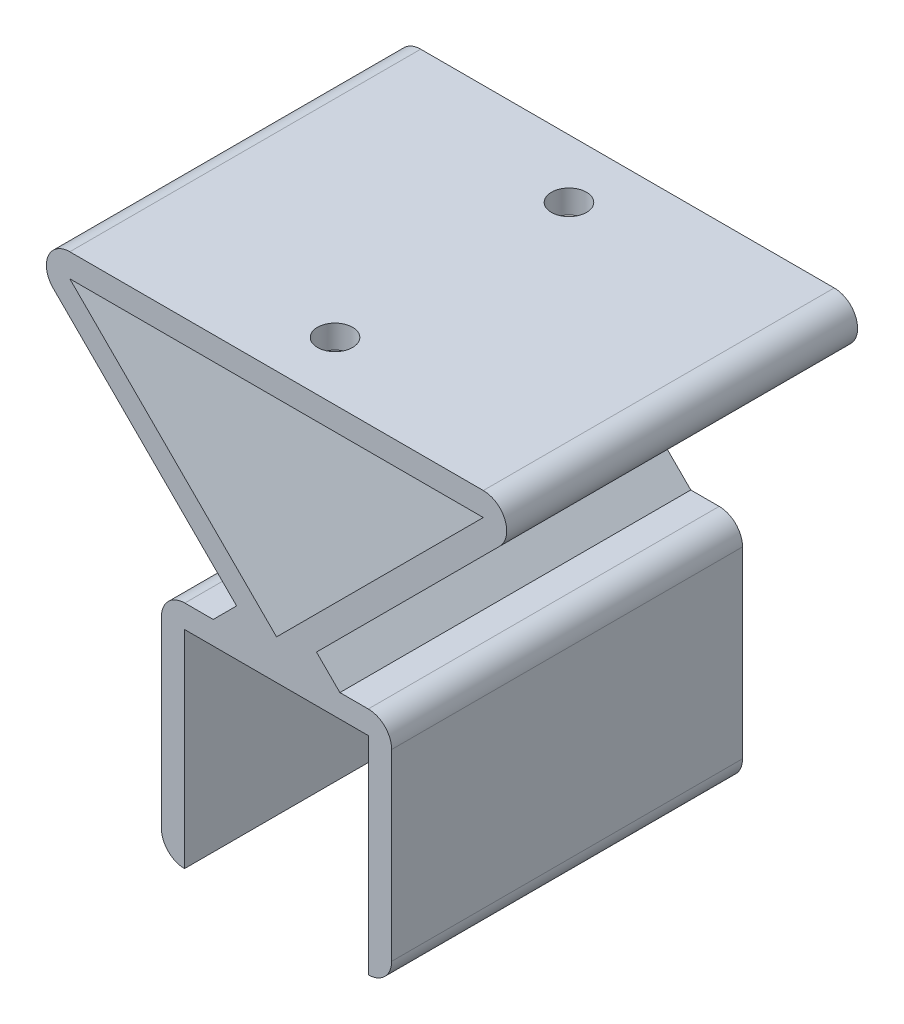
ISO-10303-21;
HEADER;
FILE_DESCRIPTION(('STEP AP214'),'2;1');
FILE_NAME('part.step','',(''),(''),'','','');
FILE_SCHEMA(('AUTOMOTIVE_DESIGN { 1 0 10303 214 1 1 1 1 }'));
ENDSEC;
DATA;
#1=APPLICATION_CONTEXT('core data for automotive mechanical design processes');
#2=APPLICATION_PROTOCOL_DEFINITION('international standard','automotive_design',2000,#1);
#3=PRODUCT_CONTEXT('',#1,'mechanical');
#4=PRODUCT('Part','Part','',(#3));
#5=PRODUCT_RELATED_PRODUCT_CATEGORY('part','',(#4));
#6=PRODUCT_DEFINITION_FORMATION('','',#4);
#7=PRODUCT_DEFINITION_CONTEXT('part definition',#1,'design');
#8=PRODUCT_DEFINITION('design','',#6,#7);
#9=PRODUCT_DEFINITION_SHAPE('','',#8);
#10=(LENGTH_UNIT() NAMED_UNIT(*) SI_UNIT(.MILLI.,.METRE.));
#11=(NAMED_UNIT(*) PLANE_ANGLE_UNIT() SI_UNIT($,.RADIAN.));
#12=(NAMED_UNIT(*) SI_UNIT($,.STERADIAN.) SOLID_ANGLE_UNIT());
#13=UNCERTAINTY_MEASURE_WITH_UNIT(LENGTH_MEASURE(1.E-05),#10,'distance_accuracy_value','');
#14=(GEOMETRIC_REPRESENTATION_CONTEXT(3) GLOBAL_UNCERTAINTY_ASSIGNED_CONTEXT((#13)) GLOBAL_UNIT_ASSIGNED_CONTEXT((#10,
#11,#12)) REPRESENTATION_CONTEXT('',''));
#15=CARTESIAN_POINT('',(0.,0.,0.));
#16=DIRECTION('',(0.,0.,1.));
#17=DIRECTION('',(1.,0.,0.));
#18=AXIS2_PLACEMENT_3D('',#15,#16,#17);
#19=CARTESIAN_POINT('',(0.,0.,38.1));
#20=DIRECTION('',(0.,0.,1.));
#21=DIRECTION('',(1.,0.,0.));
#22=AXIS2_PLACEMENT_3D('',#19,#20,#21);
#23=PLANE('',#22);
#24=DIRECTION('',(0.,-1.,0.));
#25=VECTOR('',#24,1.);
#26=CARTESIAN_POINT('',(10.,-24.2960512242138,38.1));
#27=LINE('',#26,#25);
#28=CARTESIAN_POINT('',(10.,-4.29605122421383,38.1));
#29=VERTEX_POINT('',#28);
#30=CARTESIAN_POINT('',(10.,-26.7960512242138,38.1));
#31=VERTEX_POINT('',#30);
#32=EDGE_CURVE('E349',#29,#31,#27,.T.);
#33=ORIENTED_EDGE('',*,*,#32,.T.);
#34=CARTESIAN_POINT('',(9.96000000000001,-24.2563662043738,38.1));
#35=DIRECTION('',(0.,0.,1.));
#36=DIRECTION('',(1.,0.,0.));
#37=AXIS2_PLACEMENT_3D('',#34,#35,#36);
#38=CIRCLE('',#37,2.54);
#39=CARTESIAN_POINT('',(12.5,-24.2563662043738,38.1));
#40=VERTEX_POINT('',#39);
#41=EDGE_CURVE('E258',#31,#40,#38,.T.);
#42=ORIENTED_EDGE('',*,*,#41,.T.);
#43=DIRECTION('',(0.,1.,0.));
#44=VECTOR('',#43,1.);
#45=CARTESIAN_POINT('',(12.5,-1.79605122421383,38.1));
#46=LINE('',#45,#44);
#47=CARTESIAN_POINT('',(12.5,-4.33605122421383,38.1));
#48=VERTEX_POINT('',#47);
#49=EDGE_CURVE('E287',#40,#48,#46,.T.);
#50=ORIENTED_EDGE('',*,*,#49,.T.);
#51=CARTESIAN_POINT('',(9.96,-4.33605122421383,38.1));
#52=DIRECTION('',(0.,0.,1.));
#53=DIRECTION('',(1.,0.,0.));
#54=AXIS2_PLACEMENT_3D('',#51,#52,#53);
#55=CIRCLE('',#54,2.54);
#56=CARTESIAN_POINT('',(9.96,-1.79605122421383,38.1));
#57=VERTEX_POINT('',#56);
#58=EDGE_CURVE('E249',#48,#57,#55,.T.);
#59=ORIENTED_EDGE('',*,*,#58,.T.);
#60=DIRECTION('',(-1.,0.,0.));
#61=VECTOR('',#60,1.);
#62=CARTESIAN_POINT('',(0.,-1.79605122421383,38.1));
#63=LINE('',#62,#61);
#64=CARTESIAN_POINT('',(6.87605122421381,-1.79605122421383,38.1));
#65=VERTEX_POINT('',#64);
#66=EDGE_CURVE('E282',#57,#65,#63,.T.);
#67=ORIENTED_EDGE('',*,*,#66,.T.);
#68=DIRECTION('',(-0.707106781186553,0.707106781186542,0.));
#69=VECTOR('',#68,1.);
#70=CARTESIAN_POINT('',(4.3360512242138,0.743948775786142,38.1));
#71=LINE('',#70,#69);
#72=CARTESIAN_POINT('',(4.3360512242138,0.743948775786141,38.1));
#73=VERTEX_POINT('',#72);
#74=EDGE_CURVE('E251',#65,#73,#71,.T.);
#75=ORIENTED_EDGE('',*,*,#74,.T.);
#76=DIRECTION('',(0.707106781186547,0.707106781186548,0.));
#77=VECTOR('',#76,1.);
#78=CARTESIAN_POINT('',(0.,-3.59210244842766,38.1));
#79=LINE('',#78,#77);
#80=CARTESIAN_POINT('',(24.2466915268867,20.6545890784591,38.1));
#81=VERTEX_POINT('',#80);
#82=EDGE_CURVE('E243',#73,#81,#79,.T.);
#83=ORIENTED_EDGE('',*,*,#82,.T.);
#84=CARTESIAN_POINT('',(22.4506403026729,22.4506403026729,38.1));
#85=DIRECTION('',(0.,0.,1.));
#86=DIRECTION('',(1.,0.,0.));
#87=AXIS2_PLACEMENT_3D('',#84,#85,#86);
#88=CIRCLE('',#87,2.54);
#89=CARTESIAN_POINT('',(22.4506403026729,24.9906403026729,38.1));
#90=VERTEX_POINT('',#89);
#91=EDGE_CURVE('E241',#81,#90,#88,.T.);
#92=ORIENTED_EDGE('',*,*,#91,.T.);
#93=DIRECTION('',(-1.,0.,0.));
#94=VECTOR('',#93,1.);
#95=CARTESIAN_POINT('',(28.5827427511005,24.9906403026729,38.1));
#96=LINE('',#95,#94);
#97=CARTESIAN_POINT('',(-22.4506403026729,24.9906403026729,38.1));
#98=VERTEX_POINT('',#97);
#99=EDGE_CURVE('E230',#90,#98,#96,.T.);
#100=ORIENTED_EDGE('',*,*,#99,.T.);
#101=CARTESIAN_POINT('',(-22.4506403026729,22.4506403026729,38.1));
#102=DIRECTION('',(0.,0.,1.));
#103=DIRECTION('',(1.,0.,0.));
#104=AXIS2_PLACEMENT_3D('',#101,#102,#103);
#105=CIRCLE('',#104,2.54);
#106=CARTESIAN_POINT('',(-24.2466915268867,20.6545890784591,38.1));
#107=VERTEX_POINT('',#106);
#108=EDGE_CURVE('E237',#98,#107,#105,.T.);
#109=ORIENTED_EDGE('',*,*,#108,.T.);
#110=DIRECTION('',(0.707106781186548,-0.707106781186547,0.));
#111=VECTOR('',#110,1.);
#112=CARTESIAN_POINT('',(-28.5827427511005,24.9906403026729,38.1));
#113=LINE('',#112,#111);
#114=CARTESIAN_POINT('',(-4.33605122421382,0.743948775786162,38.1));
#115=VERTEX_POINT('',#114);
#116=EDGE_CURVE('E298',#107,#115,#113,.T.);
#117=ORIENTED_EDGE('',*,*,#116,.T.);
#118=DIRECTION('',(-0.70710678118655,-0.707106781186545,0.));
#119=VECTOR('',#118,1.);
#120=CARTESIAN_POINT('',(-4.33605122421381,0.743948775786159,38.1));
#121=LINE('',#120,#119);
#122=CARTESIAN_POINT('',(-6.87605122421382,-1.79605122421383,38.1));
#123=VERTEX_POINT('',#122);
#124=EDGE_CURVE('E319',#115,#123,#121,.T.);
#125=ORIENTED_EDGE('',*,*,#124,.T.);
#126=CARTESIAN_POINT('',(-9.96,-1.79605122421383,38.1));
#127=VERTEX_POINT('',#126);
#128=EDGE_CURVE('E283',#123,#127,#63,.T.);
#129=ORIENTED_EDGE('',*,*,#128,.T.);
#130=CARTESIAN_POINT('',(-9.96,-4.33605122421383,38.1));
#131=DIRECTION('',(0.,0.,1.));
#132=DIRECTION('',(1.,0.,0.));
#133=AXIS2_PLACEMENT_3D('',#130,#131,#132);
#134=CIRCLE('',#133,2.54);
#135=CARTESIAN_POINT('',(-12.5,-4.33605122421383,38.1));
#136=VERTEX_POINT('',#135);
#137=EDGE_CURVE('E247',#127,#136,#134,.T.);
#138=ORIENTED_EDGE('',*,*,#137,.T.);
#139=DIRECTION('',(0.,-1.,0.));
#140=VECTOR('',#139,1.);
#141=CARTESIAN_POINT('',(-12.5,-1.79605122421383,38.1));
#142=LINE('',#141,#140);
#143=CARTESIAN_POINT('',(-12.5,-24.2563662043738,38.1));
#144=VERTEX_POINT('',#143);
#145=EDGE_CURVE('E355',#136,#144,#142,.T.);
#146=ORIENTED_EDGE('',*,*,#145,.T.);
#147=CARTESIAN_POINT('',(-9.96,-24.2563662043738,38.1));
#148=DIRECTION('',(0.,0.,1.));
#149=DIRECTION('',(1.,0.,0.));
#150=AXIS2_PLACEMENT_3D('',#147,#148,#149);
#151=CIRCLE('',#150,2.54);
#152=CARTESIAN_POINT('',(-10.,-26.7960512242138,38.1));
#153=VERTEX_POINT('',#152);
#154=EDGE_CURVE('E256',#144,#153,#151,.T.);
#155=ORIENTED_EDGE('',*,*,#154,.T.);
#156=DIRECTION('',(0.,1.,0.));
#157=VECTOR('',#156,1.);
#158=CARTESIAN_POINT('',(-10.,-4.29605122421383,38.1));
#159=LINE('',#158,#157);
#160=CARTESIAN_POINT('',(-10.,-4.29605122421383,38.1));
#161=VERTEX_POINT('',#160);
#162=EDGE_CURVE('E184',#153,#161,#159,.T.);
#163=ORIENTED_EDGE('',*,*,#162,.T.);
#164=DIRECTION('',(1.,0.,0.));
#165=VECTOR('',#164,1.);
#166=CARTESIAN_POINT('',(0.,-4.29605122421383,38.1));
#167=LINE('',#166,#165);
#168=EDGE_CURVE('E350',#161,#29,#167,.T.);
#169=ORIENTED_EDGE('',*,*,#168,.T.);
#170=EDGE_LOOP('',(#33,#42,#50,#59,#67,#75,#83,#92,#100,#109,#117,#125,#129,#138,#146,#155,#163,#169));
#171=FACE_BOUND('',#170,.T.);
#172=DIRECTION('',(0.707106781186547,0.707106781186548,0.));
#173=VECTOR('',#172,1.);
#174=CARTESIAN_POINT('',(0.,0.,38.1));
#175=LINE('',#174,#173);
#176=CARTESIAN_POINT('',(0.,0.,38.1));
#177=VERTEX_POINT('',#176);
#178=CARTESIAN_POINT('',(22.4506403026729,22.4506403026729,38.1));
#179=VERTEX_POINT('',#178);
#180=EDGE_CURVE('E534',#177,#179,#175,.T.);
#181=ORIENTED_EDGE('',*,*,#180,.F.);
#182=DIRECTION('',(0.707106781186548,-0.707106781186548,0.));
#183=VECTOR('',#182,1.);
#184=CARTESIAN_POINT('',(-22.4506403026729,22.4506403026729,38.1));
#185=LINE('',#184,#183);
#186=CARTESIAN_POINT('',(-22.4506403026729,22.4506403026729,38.1));
#187=VERTEX_POINT('',#186);
#188=EDGE_CURVE('E387',#187,#177,#185,.T.);
#189=ORIENTED_EDGE('',*,*,#188,.F.);
#190=DIRECTION('',(-1.,0.,0.));
#191=VECTOR('',#190,1.);
#192=CARTESIAN_POINT('',(22.4506403026729,22.4506403026729,38.1));
#193=LINE('',#192,#191);
#194=EDGE_CURVE('E383',#179,#187,#193,.T.);
#195=ORIENTED_EDGE('',*,*,#194,.F.);
#196=EDGE_LOOP('',(#181,#189,#195));
#197=FACE_BOUND('',#196,.T.);
#198=ADVANCED_FACE('F33',(#171,#197),#23,.T.);
#199=CARTESIAN_POINT('',(0.,0.,0.));
#200=DIRECTION('',(0.,0.,1.));
#201=DIRECTION('',(1.,0.,0.));
#202=AXIS2_PLACEMENT_3D('',#199,#200,#201);
#203=PLANE('',#202);
#204=DIRECTION('',(0.,1.,0.));
#205=VECTOR('',#204,1.);
#206=CARTESIAN_POINT('',(12.5,-1.79605122421383,0.));
#207=LINE('',#206,#205);
#208=CARTESIAN_POINT('',(12.5,-24.2563662043738,0.));
#209=VERTEX_POINT('',#208);
#210=CARTESIAN_POINT('',(12.5,-4.33605122421383,0.));
#211=VERTEX_POINT('',#210);
#212=EDGE_CURVE('E188',#209,#211,#207,.T.);
#213=ORIENTED_EDGE('',*,*,#212,.F.);
#214=CARTESIAN_POINT('',(9.96000000000001,-24.2563662043738,0.));
#215=DIRECTION('',(0.,0.,1.));
#216=DIRECTION('',(1.,0.,0.));
#217=AXIS2_PLACEMENT_3D('',#214,#215,#216);
#218=CIRCLE('',#217,2.54);
#219=CARTESIAN_POINT('',(10.,-26.7960512242138,0.));
#220=VERTEX_POINT('',#219);
#221=EDGE_CURVE('E205',#209,#220,#218,.F.);
#222=ORIENTED_EDGE('',*,*,#221,.T.);
#223=DIRECTION('',(0.,-1.,0.));
#224=VECTOR('',#223,1.);
#225=CARTESIAN_POINT('',(10.,-4.29605122421383,0.));
#226=LINE('',#225,#224);
#227=CARTESIAN_POINT('',(10.,-4.29605122421383,0.));
#228=VERTEX_POINT('',#227);
#229=EDGE_CURVE('E359',#228,#220,#226,.T.);
#230=ORIENTED_EDGE('',*,*,#229,.F.);
#231=DIRECTION('',(1.,0.,0.));
#232=VECTOR('',#231,1.);
#233=CARTESIAN_POINT('',(0.,-4.29605122421383,0.));
#234=LINE('',#233,#232);
#235=CARTESIAN_POINT('',(-10.,-4.29605122421383,0.));
#236=VERTEX_POINT('',#235);
#237=EDGE_CURVE('E198',#236,#228,#234,.T.);
#238=ORIENTED_EDGE('',*,*,#237,.F.);
#239=DIRECTION('',(0.,1.,0.));
#240=VECTOR('',#239,1.);
#241=CARTESIAN_POINT('',(-10.,-24.2960512242138,0.));
#242=LINE('',#241,#240);
#243=CARTESIAN_POINT('',(-10.,-26.7960512242138,0.));
#244=VERTEX_POINT('',#243);
#245=EDGE_CURVE('E181',#244,#236,#242,.T.);
#246=ORIENTED_EDGE('',*,*,#245,.F.);
#247=CARTESIAN_POINT('',(-9.96,-24.2563662043738,0.));
#248=DIRECTION('',(0.,0.,1.));
#249=DIRECTION('',(1.,0.,0.));
#250=AXIS2_PLACEMENT_3D('',#247,#248,#249);
#251=CIRCLE('',#250,2.54);
#252=CARTESIAN_POINT('',(-12.5,-24.2563662043738,0.));
#253=VERTEX_POINT('',#252);
#254=EDGE_CURVE('E195',#244,#253,#251,.F.);
#255=ORIENTED_EDGE('',*,*,#254,.T.);
#256=DIRECTION('',(0.,-1.,0.));
#257=VECTOR('',#256,1.);
#258=CARTESIAN_POINT('',(-12.5,-1.79605122421383,0.));
#259=LINE('',#258,#257);
#260=CARTESIAN_POINT('',(-12.5,-4.33605122421383,0.));
#261=VERTEX_POINT('',#260);
#262=EDGE_CURVE('E199',#261,#253,#259,.T.);
#263=ORIENTED_EDGE('',*,*,#262,.F.);
#264=CARTESIAN_POINT('',(-9.96,-4.33605122421383,0.));
#265=DIRECTION('',(0.,0.,1.));
#266=DIRECTION('',(1.,0.,0.));
#267=AXIS2_PLACEMENT_3D('',#264,#265,#266);
#268=CIRCLE('',#267,2.54);
#269=CARTESIAN_POINT('',(-9.96,-1.79605122421383,0.));
#270=VERTEX_POINT('',#269);
#271=EDGE_CURVE('E210',#261,#270,#268,.F.);
#272=ORIENTED_EDGE('',*,*,#271,.T.);
#273=DIRECTION('',(-1.,0.,0.));
#274=VECTOR('',#273,1.);
#275=CARTESIAN_POINT('',(0.,-1.79605122421383,0.));
#276=LINE('',#275,#274);
#277=CARTESIAN_POINT('',(-6.87605122421382,-1.79605122421383,0.));
#278=VERTEX_POINT('',#277);
#279=EDGE_CURVE('E268',#278,#270,#276,.T.);
#280=ORIENTED_EDGE('',*,*,#279,.F.);
#281=DIRECTION('',(0.70710678118655,0.707106781186545,0.));
#282=VECTOR('',#281,1.);
#283=CARTESIAN_POINT('',(-2.53999999999997,2.53999999999999,0.));
#284=LINE('',#283,#282);
#285=CARTESIAN_POINT('',(-4.33605122421382,0.743948775786162,0.));
#286=VERTEX_POINT('',#285);
#287=EDGE_CURVE('E321',#278,#286,#284,.T.);
#288=ORIENTED_EDGE('',*,*,#287,.T.);
#289=DIRECTION('',(0.707106781186548,-0.707106781186547,0.));
#290=VECTOR('',#289,1.);
#291=CARTESIAN_POINT('',(-28.5827427511005,24.9906403026729,0.));
#292=LINE('',#291,#290);
#293=CARTESIAN_POINT('',(-24.2466915268867,20.6545890784591,0.));
#294=VERTEX_POINT('',#293);
#295=EDGE_CURVE('E269',#294,#286,#292,.T.);
#296=ORIENTED_EDGE('',*,*,#295,.F.);
#297=CARTESIAN_POINT('',(-22.4506403026729,22.4506403026729,0.));
#298=DIRECTION('',(0.,0.,1.));
#299=DIRECTION('',(1.,0.,0.));
#300=AXIS2_PLACEMENT_3D('',#297,#298,#299);
#301=CIRCLE('',#300,2.54);
#302=CARTESIAN_POINT('',(-22.4506403026729,24.9906403026729,0.));
#303=VERTEX_POINT('',#302);
#304=EDGE_CURVE('E48',#294,#303,#301,.F.);
#305=ORIENTED_EDGE('',*,*,#304,.T.);
#306=DIRECTION('',(-1.,0.,0.));
#307=VECTOR('',#306,1.);
#308=CARTESIAN_POINT('',(28.5827427511005,24.9906403026729,0.));
#309=LINE('',#308,#307);
#310=CARTESIAN_POINT('',(22.4506403026729,24.9906403026729,0.));
#311=VERTEX_POINT('',#310);
#312=EDGE_CURVE('E231',#311,#303,#309,.T.);
#313=ORIENTED_EDGE('',*,*,#312,.F.);
#314=CARTESIAN_POINT('',(22.4506403026729,22.4506403026729,0.));
#315=DIRECTION('',(0.,0.,1.));
#316=DIRECTION('',(1.,0.,0.));
#317=AXIS2_PLACEMENT_3D('',#314,#315,#316);
#318=CIRCLE('',#317,2.54);
#319=CARTESIAN_POINT('',(24.2466915268867,20.6545890784591,0.));
#320=VERTEX_POINT('',#319);
#321=EDGE_CURVE('E56',#311,#320,#318,.F.);
#322=ORIENTED_EDGE('',*,*,#321,.T.);
#323=DIRECTION('',(0.707106781186547,0.707106781186548,0.));
#324=VECTOR('',#323,1.);
#325=CARTESIAN_POINT('',(0.,-3.59210244842766,0.));
#326=LINE('',#325,#324);
#327=CARTESIAN_POINT('',(4.3360512242138,0.743948775786141,0.));
#328=VERTEX_POINT('',#327);
#329=EDGE_CURVE('E310',#328,#320,#326,.T.);
#330=ORIENTED_EDGE('',*,*,#329,.F.);
#331=DIRECTION('',(0.707106781186553,-0.707106781186542,0.));
#332=VECTOR('',#331,1.);
#333=CARTESIAN_POINT('',(2.53999999999994,2.53999999999998,0.));
#334=LINE('',#333,#332);
#335=CARTESIAN_POINT('',(6.87605122421381,-1.79605122421383,0.));
#336=VERTEX_POINT('',#335);
#337=EDGE_CURVE('E323',#328,#336,#334,.T.);
#338=ORIENTED_EDGE('',*,*,#337,.T.);
#339=CARTESIAN_POINT('',(9.96,-1.79605122421383,0.));
#340=VERTEX_POINT('',#339);
#341=EDGE_CURVE('E265',#340,#336,#276,.T.);
#342=ORIENTED_EDGE('',*,*,#341,.F.);
#343=CARTESIAN_POINT('',(9.96,-4.33605122421383,0.));
#344=DIRECTION('',(0.,0.,1.));
#345=DIRECTION('',(1.,0.,0.));
#346=AXIS2_PLACEMENT_3D('',#343,#344,#345);
#347=CIRCLE('',#346,2.54);
#348=EDGE_CURVE('E206',#340,#211,#347,.F.);
#349=ORIENTED_EDGE('',*,*,#348,.T.);
#350=EDGE_LOOP('',(#213,#222,#230,#238,#246,#255,#263,#272,#280,#288,#296,#305,#313,#322,#330,
#338,#342,#349));
#351=FACE_BOUND('',#350,.T.);
#352=DIRECTION('',(0.707106781186548,-0.707106781186548,0.));
#353=VECTOR('',#352,1.);
#354=CARTESIAN_POINT('',(-22.4506403026729,22.4506403026729,0.));
#355=LINE('',#354,#353);
#356=CARTESIAN_POINT('',(-22.4506403026729,22.4506403026729,0.));
#357=VERTEX_POINT('',#356);
#358=CARTESIAN_POINT('',(0.,0.,0.));
#359=VERTEX_POINT('',#358);
#360=EDGE_CURVE('E374',#357,#359,#355,.T.);
#361=ORIENTED_EDGE('',*,*,#360,.T.);
#362=DIRECTION('',(0.707106781186547,0.707106781186548,0.));
#363=VECTOR('',#362,1.);
#364=CARTESIAN_POINT('',(0.,0.,0.));
#365=LINE('',#364,#363);
#366=CARTESIAN_POINT('',(22.4506403026729,22.4506403026729,0.));
#367=VERTEX_POINT('',#366);
#368=EDGE_CURVE('E376',#359,#367,#365,.T.);
#369=ORIENTED_EDGE('',*,*,#368,.T.);
#370=DIRECTION('',(-1.,0.,0.));
#371=VECTOR('',#370,1.);
#372=CARTESIAN_POINT('',(22.4506403026729,22.4506403026729,0.));
#373=LINE('',#372,#371);
#374=EDGE_CURVE('E380',#367,#357,#373,.T.);
#375=ORIENTED_EDGE('',*,*,#374,.T.);
#376=EDGE_LOOP('',(#361,#369,#375));
#377=FACE_BOUND('',#376,.T.);
#378=ADVANCED_FACE('F192',(#351,#377),#203,.F.);
#379=CARTESIAN_POINT('',(-28.5827427511005,24.9906403026729,38.1));
#380=DIRECTION('',(0.707106781186547,0.707106781186548,0.));
#381=DIRECTION('',(-0.707106781186548,0.707106781186547,0.));
#382=AXIS2_PLACEMENT_3D('',#379,#380,#381);
#383=PLANE('',#382);
#384=ORIENTED_EDGE('',*,*,#116,.F.);
#385=DIRECTION('',(0.,0.,-1.));
#386=VECTOR('',#385,1.);
#387=CARTESIAN_POINT('',(-24.2466915268867,20.6545890784591,38.1));
#388=LINE('',#387,#386);
#389=EDGE_CURVE('E221',#107,#294,#388,.T.);
#390=ORIENTED_EDGE('',*,*,#389,.T.);
#391=ORIENTED_EDGE('',*,*,#295,.T.);
#392=DIRECTION('',(0.,0.,1.));
#393=VECTOR('',#392,1.);
#394=CARTESIAN_POINT('',(-4.33605122421381,0.743948775786159,38.1));
#395=LINE('',#394,#393);
#396=EDGE_CURVE('E242',#286,#115,#395,.T.);
#397=ORIENTED_EDGE('',*,*,#396,.T.);
#398=EDGE_LOOP('',(#384,#390,#391,#397));
#399=FACE_BOUND('',#398,.T.);
#400=ADVANCED_FACE('F399',(#399),#383,.F.);
#401=CARTESIAN_POINT('',(0.,-3.59210244842766,38.1));
#402=DIRECTION('',(-0.707106781186548,0.707106781186547,0.));
#403=DIRECTION('',(-0.707106781186547,-0.707106781186548,0.));
#404=AXIS2_PLACEMENT_3D('',#401,#402,#403);
#405=PLANE('',#404);
#406=ORIENTED_EDGE('',*,*,#329,.T.);
#407=DIRECTION('',(0.,0.,-1.));
#408=VECTOR('',#407,1.);
#409=CARTESIAN_POINT('',(24.2466915268867,20.6545890784591,38.1));
#410=LINE('',#409,#408);
#411=EDGE_CURVE('E11',#320,#81,#410,.F.);
#412=ORIENTED_EDGE('',*,*,#411,.T.);
#413=ORIENTED_EDGE('',*,*,#82,.F.);
#414=DIRECTION('',(0.,0.,-1.));
#415=VECTOR('',#414,1.);
#416=CARTESIAN_POINT('',(4.3360512242138,0.743948775786141,38.1));
#417=LINE('',#416,#415);
#418=EDGE_CURVE('E313',#73,#328,#417,.T.);
#419=ORIENTED_EDGE('',*,*,#418,.T.);
#420=EDGE_LOOP('',(#406,#412,#413,#419));
#421=FACE_BOUND('',#420,.T.);
#422=ADVANCED_FACE('F334',(#421),#405,.F.);
#423=CARTESIAN_POINT('',(28.5827427511005,24.9906403026729,38.1));
#424=DIRECTION('',(0.,-1.,0.));
#425=DIRECTION('',(1.,0.,0.));
#426=AXIS2_PLACEMENT_3D('',#423,#424,#425);
#427=PLANE('',#426);
#428=CARTESIAN_POINT('',(0.,24.9906403026729,6.35));
#429=DIRECTION('',(0.,1.,0.));
#430=DIRECTION('',(-1.,0.,0.));
#431=AXIS2_PLACEMENT_3D('',#428,#429,#430);
#432=CIRCLE('',#431,1.905);
#433=CARTESIAN_POINT('',(-1.90500000000001,24.9906403026729,6.35));
#434=VERTEX_POINT('',#433);
#435=EDGE_CURVE('E669',#434,#434,#432,.T.);
#436=ORIENTED_EDGE('',*,*,#435,.F.);
#437=EDGE_LOOP('',(#436));
#438=FACE_BOUND('',#437,.T.);
#439=CARTESIAN_POINT('',(0.,24.9906403026729,31.75));
#440=DIRECTION('',(0.,1.,0.));
#441=DIRECTION('',(-1.,0.,0.));
#442=AXIS2_PLACEMENT_3D('',#439,#440,#441);
#443=CIRCLE('',#442,1.905);
#444=CARTESIAN_POINT('',(-1.905,24.9906403026729,31.75));
#445=VERTEX_POINT('',#444);
#446=EDGE_CURVE('E275',#445,#445,#443,.T.);
#447=ORIENTED_EDGE('',*,*,#446,.F.);
#448=EDGE_LOOP('',(#447));
#449=FACE_BOUND('',#448,.T.);
#450=ORIENTED_EDGE('',*,*,#312,.T.);
#451=DIRECTION('',(0.,0.,-1.));
#452=VECTOR('',#451,1.);
#453=CARTESIAN_POINT('',(-22.4506403026729,24.9906403026729,38.1));
#454=LINE('',#453,#452);
#455=EDGE_CURVE('E41',#303,#98,#454,.F.);
#456=ORIENTED_EDGE('',*,*,#455,.T.);
#457=ORIENTED_EDGE('',*,*,#99,.F.);
#458=DIRECTION('',(0.,0.,-1.));
#459=VECTOR('',#458,1.);
#460=CARTESIAN_POINT('',(22.4506403026729,24.9906403026729,38.1));
#461=LINE('',#460,#459);
#462=EDGE_CURVE('E224',#90,#311,#461,.T.);
#463=ORIENTED_EDGE('',*,*,#462,.T.);
#464=EDGE_LOOP('',(#450,#456,#457,#463));
#465=FACE_BOUND('',#464,.T.);
#466=ADVANCED_FACE('F229',(#438,#449,#465),#427,.F.);
#467=CARTESIAN_POINT('',(-22.4506403026729,22.4506403026729,38.1));
#468=DIRECTION('',(0.707106781186548,0.707106781186548,0.));
#469=DIRECTION('',(-0.707106781186548,0.707106781186548,0.));
#470=AXIS2_PLACEMENT_3D('',#467,#468,#469);
#471=PLANE('',#470);
#472=ORIENTED_EDGE('',*,*,#360,.F.);
#473=DIRECTION('',(0.,0.,-1.));
#474=VECTOR('',#473,1.);
#475=CARTESIAN_POINT('',(-22.4506403026729,22.4506403026729,38.1));
#476=LINE('',#475,#474);
#477=EDGE_CURVE('E388',#187,#357,#476,.T.);
#478=ORIENTED_EDGE('',*,*,#477,.F.);
#479=ORIENTED_EDGE('',*,*,#188,.T.);
#480=DIRECTION('',(0.,0.,-1.));
#481=VECTOR('',#480,1.);
#482=CARTESIAN_POINT('',(0.,0.,38.1));
#483=LINE('',#482,#481);
#484=EDGE_CURVE('E393',#177,#359,#483,.T.);
#485=ORIENTED_EDGE('',*,*,#484,.T.);
#486=EDGE_LOOP('',(#472,#478,#479,#485));
#487=FACE_BOUND('',#486,.T.);
#488=ADVANCED_FACE('F435',(#487),#471,.T.);
#489=CARTESIAN_POINT('',(0.,0.,38.1));
#490=DIRECTION('',(-0.707106781186548,0.707106781186547,0.));
#491=DIRECTION('',(-0.707106781186547,-0.707106781186548,0.));
#492=AXIS2_PLACEMENT_3D('',#489,#490,#491);
#493=PLANE('',#492);
#494=ORIENTED_EDGE('',*,*,#368,.F.);
#495=ORIENTED_EDGE('',*,*,#484,.F.);
#496=ORIENTED_EDGE('',*,*,#180,.T.);
#497=DIRECTION('',(0.,0.,-1.));
#498=VECTOR('',#497,1.);
#499=CARTESIAN_POINT('',(22.4506403026729,22.4506403026729,38.1));
#500=LINE('',#499,#498);
#501=EDGE_CURVE('E391',#179,#367,#500,.T.);
#502=ORIENTED_EDGE('',*,*,#501,.T.);
#503=EDGE_LOOP('',(#494,#495,#496,#502));
#504=FACE_BOUND('',#503,.T.);
#505=ADVANCED_FACE('F488',(#504),#493,.T.);
#506=CARTESIAN_POINT('',(22.4506403026729,22.4506403026729,38.1));
#507=DIRECTION('',(0.,-1.,0.));
#508=DIRECTION('',(1.,0.,0.));
#509=AXIS2_PLACEMENT_3D('',#506,#507,#508);
#510=PLANE('',#509);
#511=CARTESIAN_POINT('',(0.,22.4506403026729,6.35));
#512=DIRECTION('',(0.,-1.,0.));
#513=DIRECTION('',(1.,0.,0.));
#514=AXIS2_PLACEMENT_3D('',#511,#512,#513);
#515=CIRCLE('',#514,1.905);
#516=CARTESIAN_POINT('',(1.90499999999999,22.4506403026729,6.35));
#517=VERTEX_POINT('',#516);
#518=EDGE_CURVE('E666',#517,#517,#515,.F.);
#519=ORIENTED_EDGE('',*,*,#518,.T.);
#520=EDGE_LOOP('',(#519));
#521=FACE_BOUND('',#520,.T.);
#522=CARTESIAN_POINT('',(0.,22.4506403026729,31.75));
#523=DIRECTION('',(0.,-1.,0.));
#524=DIRECTION('',(1.,0.,0.));
#525=AXIS2_PLACEMENT_3D('',#522,#523,#524);
#526=CIRCLE('',#525,1.905);
#527=CARTESIAN_POINT('',(1.905,22.4506403026729,31.75));
#528=VERTEX_POINT('',#527);
#529=EDGE_CURVE('E670',#528,#528,#526,.F.);
#530=ORIENTED_EDGE('',*,*,#529,.T.);
#531=EDGE_LOOP('',(#530));
#532=FACE_BOUND('',#531,.T.);
#533=ORIENTED_EDGE('',*,*,#374,.F.);
#534=ORIENTED_EDGE('',*,*,#501,.F.);
#535=ORIENTED_EDGE('',*,*,#194,.T.);
#536=ORIENTED_EDGE('',*,*,#477,.T.);
#537=EDGE_LOOP('',(#533,#534,#535,#536));
#538=FACE_BOUND('',#537,.T.);
#539=ADVANCED_FACE('F483',(#521,#532,#538),#510,.T.);
#540=CARTESIAN_POINT('',(0.,-1.79605122421383,0.));
#541=DIRECTION('',(0.,1.,0.));
#542=DIRECTION('',(-1.,0.,0.));
#543=AXIS2_PLACEMENT_3D('',#540,#541,#542);
#544=PLANE('',#543);
#545=ORIENTED_EDGE('',*,*,#279,.T.);
#546=DIRECTION('',(0.,0.,1.));
#547=VECTOR('',#546,1.);
#548=CARTESIAN_POINT('',(-9.96,-1.79605122421383,0.));
#549=LINE('',#548,#547);
#550=EDGE_CURVE('E218',#270,#127,#549,.T.);
#551=ORIENTED_EDGE('',*,*,#550,.T.);
#552=ORIENTED_EDGE('',*,*,#128,.F.);
#553=DIRECTION('',(0.,0.,-1.));
#554=VECTOR('',#553,1.);
#555=CARTESIAN_POINT('',(-6.87605122421382,-1.79605122421383,0.));
#556=LINE('',#555,#554);
#557=EDGE_CURVE('E288',#123,#278,#556,.T.);
#558=ORIENTED_EDGE('',*,*,#557,.T.);
#559=EDGE_LOOP('',(#545,#551,#552,#558));
#560=FACE_BOUND('',#559,.T.);
#561=ADVANCED_FACE('F409',(#560),#544,.T.);
#562=ORIENTED_EDGE('',*,*,#66,.F.);
#563=DIRECTION('',(0.,0.,1.));
#564=VECTOR('',#563,1.);
#565=CARTESIAN_POINT('',(9.96,-1.79605122421383,0.));
#566=LINE('',#565,#564);
#567=EDGE_CURVE('E216',#57,#340,#566,.F.);
#568=ORIENTED_EDGE('',*,*,#567,.T.);
#569=ORIENTED_EDGE('',*,*,#341,.T.);
#570=DIRECTION('',(0.,0.,1.));
#571=VECTOR('',#570,1.);
#572=CARTESIAN_POINT('',(6.87605122421381,-1.79605122421383,0.));
#573=LINE('',#572,#571);
#574=EDGE_CURVE('E316',#336,#65,#573,.T.);
#575=ORIENTED_EDGE('',*,*,#574,.T.);
#576=EDGE_LOOP('',(#562,#568,#569,#575));
#577=FACE_BOUND('',#576,.T.);
#578=ADVANCED_FACE('F337',(#577),#544,.T.);
#579=CARTESIAN_POINT('',(12.5,-1.79605122421383,0.));
#580=DIRECTION('',(1.,0.,0.));
#581=DIRECTION('',(0.,1.,0.));
#582=AXIS2_PLACEMENT_3D('',#579,#580,#581);
#583=PLANE('',#582);
#584=ORIENTED_EDGE('',*,*,#49,.F.);
#585=DIRECTION('',(0.,0.,1.));
#586=VECTOR('',#585,1.);
#587=CARTESIAN_POINT('',(12.5,-24.2563662043738,0.));
#588=LINE('',#587,#586);
#589=EDGE_CURVE('E263',#40,#209,#588,.F.);
#590=ORIENTED_EDGE('',*,*,#589,.T.);
#591=ORIENTED_EDGE('',*,*,#212,.T.);
#592=DIRECTION('',(0.,0.,1.));
#593=VECTOR('',#592,1.);
#594=CARTESIAN_POINT('',(12.5,-4.33605122421383,0.));
#595=LINE('',#594,#593);
#596=EDGE_CURVE('E260',#211,#48,#595,.T.);
#597=ORIENTED_EDGE('',*,*,#596,.T.);
#598=EDGE_LOOP('',(#584,#590,#591,#597));
#599=FACE_BOUND('',#598,.T.);
#600=ADVANCED_FACE('F347',(#599),#583,.T.);
#601=CARTESIAN_POINT('',(10.,-24.2960512242138,0.));
#602=DIRECTION('',(-1.,0.,0.));
#603=DIRECTION('',(0.,0.,1.));
#604=AXIS2_PLACEMENT_3D('',#601,#602,#603);
#605=PLANE('',#604);
#606=ORIENTED_EDGE('',*,*,#32,.F.);
#607=DIRECTION('',(0.,0.,1.));
#608=VECTOR('',#607,1.);
#609=CARTESIAN_POINT('',(10.,-4.29605122421383,0.));
#610=LINE('',#609,#608);
#611=EDGE_CURVE('E366',#228,#29,#610,.T.);
#612=ORIENTED_EDGE('',*,*,#611,.F.);
#613=ORIENTED_EDGE('',*,*,#229,.T.);
#614=DIRECTION('',(0.,0.,1.));
#615=VECTOR('',#614,1.);
#616=CARTESIAN_POINT('',(10.,-26.7960512242138,0.));
#617=LINE('',#616,#615);
#618=EDGE_CURVE('E294',#220,#31,#617,.T.);
#619=ORIENTED_EDGE('',*,*,#618,.T.);
#620=EDGE_LOOP('',(#606,#612,#613,#619));
#621=FACE_BOUND('',#620,.T.);
#622=ADVANCED_FACE('F368',(#621),#605,.T.);
#623=CARTESIAN_POINT('',(0.,-4.29605122421383,0.));
#624=DIRECTION('',(0.,-1.,0.));
#625=DIRECTION('',(1.,0.,0.));
#626=AXIS2_PLACEMENT_3D('',#623,#624,#625);
#627=PLANE('',#626);
#628=ORIENTED_EDGE('',*,*,#168,.F.);
#629=DIRECTION('',(0.,0.,1.));
#630=VECTOR('',#629,1.);
#631=CARTESIAN_POINT('',(-10.,-4.29605122421383,0.));
#632=LINE('',#631,#630);
#633=EDGE_CURVE('E187',#236,#161,#632,.T.);
#634=ORIENTED_EDGE('',*,*,#633,.F.);
#635=ORIENTED_EDGE('',*,*,#237,.T.);
#636=ORIENTED_EDGE('',*,*,#611,.T.);
#637=EDGE_LOOP('',(#628,#634,#635,#636));
#638=FACE_BOUND('',#637,.T.);
#639=ADVANCED_FACE('F365',(#638),#627,.T.);
#640=CARTESIAN_POINT('',(-10.,-4.29605122421383,0.));
#641=DIRECTION('',(1.,0.,0.));
#642=DIRECTION('',(0.,1.,0.));
#643=AXIS2_PLACEMENT_3D('',#640,#641,#642);
#644=PLANE('',#643);
#645=ORIENTED_EDGE('',*,*,#162,.F.);
#646=DIRECTION('',(0.,0.,1.));
#647=VECTOR('',#646,1.);
#648=CARTESIAN_POINT('',(-10.,-26.7960512242138,0.));
#649=LINE('',#648,#647);
#650=EDGE_CURVE('E177',#244,#153,#649,.T.);
#651=ORIENTED_EDGE('',*,*,#650,.F.);
#652=ORIENTED_EDGE('',*,*,#245,.T.);
#653=ORIENTED_EDGE('',*,*,#633,.T.);
#654=EDGE_LOOP('',(#645,#651,#652,#653));
#655=FACE_BOUND('',#654,.T.);
#656=ADVANCED_FACE('F179',(#655),#644,.T.);
#657=CARTESIAN_POINT('',(-12.5,-1.79605122421383,0.));
#658=DIRECTION('',(-1.,0.,0.));
#659=DIRECTION('',(0.,-1.,0.));
#660=AXIS2_PLACEMENT_3D('',#657,#658,#659);
#661=PLANE('',#660);
#662=ORIENTED_EDGE('',*,*,#262,.T.);
#663=DIRECTION('',(0.,0.,-1.));
#664=VECTOR('',#663,1.);
#665=CARTESIAN_POINT('',(-12.5,-24.2563662043738,38.1));
#666=LINE('',#665,#664);
#667=EDGE_CURVE('E204',#253,#144,#666,.F.);
#668=ORIENTED_EDGE('',*,*,#667,.T.);
#669=ORIENTED_EDGE('',*,*,#145,.F.);
#670=DIRECTION('',(0.,0.,1.));
#671=VECTOR('',#670,1.);
#672=CARTESIAN_POINT('',(-12.5,-4.33605122421383,0.));
#673=LINE('',#672,#671);
#674=EDGE_CURVE('E208',#136,#261,#673,.F.);
#675=ORIENTED_EDGE('',*,*,#674,.T.);
#676=EDGE_LOOP('',(#662,#668,#669,#675));
#677=FACE_BOUND('',#676,.T.);
#678=ADVANCED_FACE('F415',(#677),#661,.T.);
#679=CARTESIAN_POINT('',(-4.33605122421381,0.743948775786159,38.1));
#680=DIRECTION('',(0.707106781186545,-0.70710678118655,0.));
#681=DIRECTION('',(0.,0.,1.));
#682=AXIS2_PLACEMENT_3D('',#679,#680,#681);
#683=PLANE('',#682);
#684=ORIENTED_EDGE('',*,*,#287,.F.);
#685=ORIENTED_EDGE('',*,*,#557,.F.);
#686=ORIENTED_EDGE('',*,*,#124,.F.);
#687=ORIENTED_EDGE('',*,*,#396,.F.);
#688=EDGE_LOOP('',(#684,#685,#686,#687));
#689=FACE_BOUND('',#688,.T.);
#690=ADVANCED_FACE('F406',(#689),#683,.F.);
#691=CARTESIAN_POINT('',(4.3360512242138,0.743948775786142,38.1));
#692=DIRECTION('',(-0.707106781186542,-0.707106781186553,0.));
#693=DIRECTION('',(0.,0.,-1.));
#694=AXIS2_PLACEMENT_3D('',#691,#692,#693);
#695=PLANE('',#694);
#696=ORIENTED_EDGE('',*,*,#74,.F.);
#697=ORIENTED_EDGE('',*,*,#574,.F.);
#698=ORIENTED_EDGE('',*,*,#337,.F.);
#699=ORIENTED_EDGE('',*,*,#418,.F.);
#700=EDGE_LOOP('',(#696,#697,#698,#699));
#701=FACE_BOUND('',#700,.T.);
#702=ADVANCED_FACE('F335',(#701),#695,.F.);
#703=CARTESIAN_POINT('',(9.96000000000001,-24.2563662043738,0.));
#704=DIRECTION('',(0.,0.,-1.));
#705=DIRECTION('',(-1.,0.,0.));
#706=AXIS2_PLACEMENT_3D('',#703,#704,#705);
#707=CYLINDRICAL_SURFACE('',#706,2.54);
#708=ORIENTED_EDGE('',*,*,#221,.F.);
#709=ORIENTED_EDGE('',*,*,#589,.F.);
#710=ORIENTED_EDGE('',*,*,#41,.F.);
#711=ORIENTED_EDGE('',*,*,#618,.F.);
#712=EDGE_LOOP('',(#708,#709,#710,#711));
#713=FACE_BOUND('',#712,.T.);
#714=ADVANCED_FACE('F373',(#713),#707,.T.);
#715=CARTESIAN_POINT('',(-9.96,-24.2563662043738,0.));
#716=DIRECTION('',(0.,0.,1.));
#717=DIRECTION('',(1.,0.,0.));
#718=AXIS2_PLACEMENT_3D('',#715,#716,#717);
#719=CYLINDRICAL_SURFACE('',#718,2.54);
#720=ORIENTED_EDGE('',*,*,#254,.F.);
#721=ORIENTED_EDGE('',*,*,#650,.T.);
#722=ORIENTED_EDGE('',*,*,#154,.F.);
#723=ORIENTED_EDGE('',*,*,#667,.F.);
#724=EDGE_LOOP('',(#720,#721,#722,#723));
#725=FACE_BOUND('',#724,.T.);
#726=ADVANCED_FACE('F202',(#725),#719,.T.);
#727=CARTESIAN_POINT('',(9.96,-4.33605122421383,0.));
#728=DIRECTION('',(0.,0.,1.));
#729=DIRECTION('',(1.,0.,0.));
#730=AXIS2_PLACEMENT_3D('',#727,#728,#729);
#731=CYLINDRICAL_SURFACE('',#730,2.54);
#732=ORIENTED_EDGE('',*,*,#348,.F.);
#733=ORIENTED_EDGE('',*,*,#567,.F.);
#734=ORIENTED_EDGE('',*,*,#58,.F.);
#735=ORIENTED_EDGE('',*,*,#596,.F.);
#736=EDGE_LOOP('',(#732,#733,#734,#735));
#737=FACE_BOUND('',#736,.T.);
#738=ADVANCED_FACE('F343',(#737),#731,.T.);
#739=CARTESIAN_POINT('',(-9.96,-4.33605122421383,0.));
#740=DIRECTION('',(0.,0.,1.));
#741=DIRECTION('',(1.,0.,0.));
#742=AXIS2_PLACEMENT_3D('',#739,#740,#741);
#743=CYLINDRICAL_SURFACE('',#742,2.54);
#744=ORIENTED_EDGE('',*,*,#271,.F.);
#745=ORIENTED_EDGE('',*,*,#674,.F.);
#746=ORIENTED_EDGE('',*,*,#137,.F.);
#747=ORIENTED_EDGE('',*,*,#550,.F.);
#748=EDGE_LOOP('',(#744,#745,#746,#747));
#749=FACE_BOUND('',#748,.T.);
#750=ADVANCED_FACE('F417',(#749),#743,.T.);
#751=CARTESIAN_POINT('',(-22.4506403026729,22.4506403026729,38.1));
#752=DIRECTION('',(0.,0.,-1.));
#753=DIRECTION('',(-1.,0.,0.));
#754=AXIS2_PLACEMENT_3D('',#751,#752,#753);
#755=CYLINDRICAL_SURFACE('',#754,2.54);
#756=ORIENTED_EDGE('',*,*,#108,.F.);
#757=ORIENTED_EDGE('',*,*,#455,.F.);
#758=ORIENTED_EDGE('',*,*,#304,.F.);
#759=ORIENTED_EDGE('',*,*,#389,.F.);
#760=EDGE_LOOP('',(#756,#757,#758,#759));
#761=FACE_BOUND('',#760,.T.);
#762=ADVANCED_FACE('F246',(#761),#755,.T.);
#763=CARTESIAN_POINT('',(22.4506403026729,22.4506403026729,38.1));
#764=DIRECTION('',(0.,0.,-1.));
#765=DIRECTION('',(-1.,0.,0.));
#766=AXIS2_PLACEMENT_3D('',#763,#764,#765);
#767=CYLINDRICAL_SURFACE('',#766,2.54);
#768=ORIENTED_EDGE('',*,*,#91,.F.);
#769=ORIENTED_EDGE('',*,*,#411,.F.);
#770=ORIENTED_EDGE('',*,*,#321,.F.);
#771=ORIENTED_EDGE('',*,*,#462,.F.);
#772=EDGE_LOOP('',(#768,#769,#770,#771));
#773=FACE_BOUND('',#772,.T.);
#774=ADVANCED_FACE('F35',(#773),#767,.T.);
#775=CARTESIAN_POINT('',(0.,-26.7970512242138,31.75));
#776=DIRECTION('',(0.,1.,0.));
#777=DIRECTION('',(-1.,0.,0.));
#778=AXIS2_PLACEMENT_3D('',#775,#776,#777);
#779=CYLINDRICAL_SURFACE('',#778,1.905);
#780=ORIENTED_EDGE('',*,*,#529,.F.);
#781=EDGE_LOOP('',(#780));
#782=FACE_BOUND('',#781,.T.);
#783=ORIENTED_EDGE('',*,*,#446,.T.);
#784=EDGE_LOOP('',(#783));
#785=FACE_BOUND('',#784,.T.);
#786=ADVANCED_FACE('F420',(#782,#785),#779,.F.);
#787=CARTESIAN_POINT('',(0.,-26.7970512242138,6.35));
#788=DIRECTION('',(0.,1.,0.));
#789=DIRECTION('',(-1.,0.,0.));
#790=AXIS2_PLACEMENT_3D('',#787,#788,#789);
#791=CYLINDRICAL_SURFACE('',#790,1.905);
#792=ORIENTED_EDGE('',*,*,#518,.F.);
#793=EDGE_LOOP('',(#792));
#794=FACE_BOUND('',#793,.T.);
#795=ORIENTED_EDGE('',*,*,#435,.T.);
#796=EDGE_LOOP('',(#795));
#797=FACE_BOUND('',#796,.T.);
#798=ADVANCED_FACE('F425',(#794,#797),#791,.F.);
#799=CLOSED_SHELL('',(#198,#378,#400,#422,#466,#488,#505,#539,#561,#578,#600,#622,#639,#656,
#678,#690,#702,#714,#726,#738,#750,#762,#774,#786,#798));
#800=MANIFOLD_SOLID_BREP('B2',#799);
#801=ADVANCED_BREP_SHAPE_REPRESENTATION('',(#18,#800),#14);
#802=SHAPE_DEFINITION_REPRESENTATION(#9,#801);
ENDSEC;
END-ISO-10303-21;
